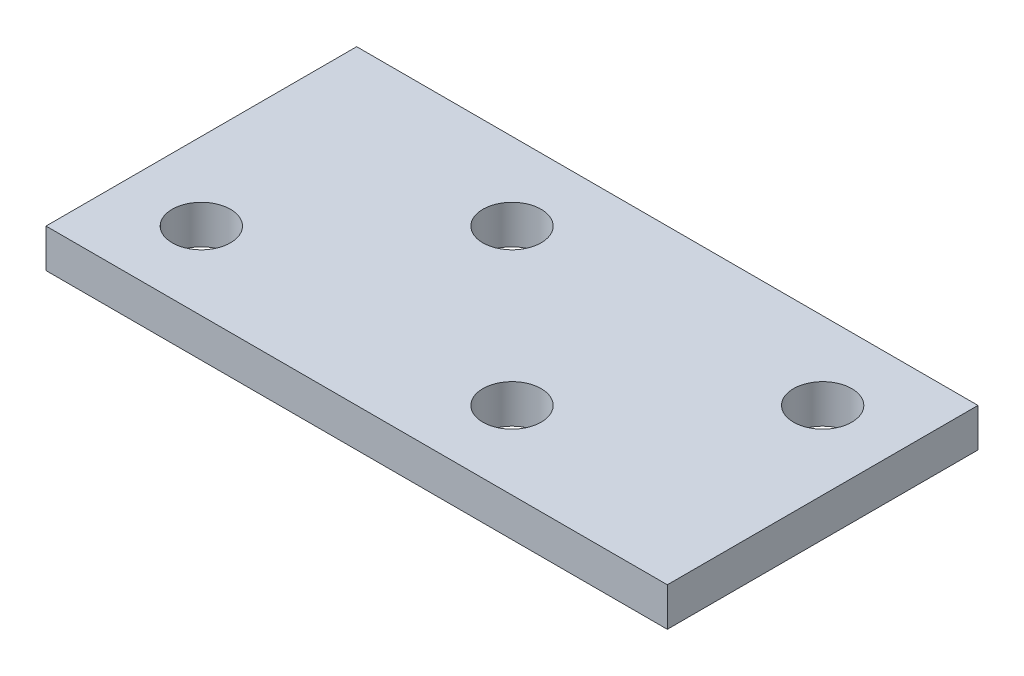
ISO-10303-21;
HEADER;
FILE_DESCRIPTION(('STEP AP214'),'2;1');
FILE_NAME('part.step','',(''),(''),'','','');
FILE_SCHEMA(('AUTOMOTIVE_DESIGN { 1 0 10303 214 1 1 1 1 }'));
ENDSEC;
DATA;
#1=APPLICATION_CONTEXT('core data for automotive mechanical design processes');
#2=APPLICATION_PROTOCOL_DEFINITION('international standard','automotive_design',2000,#1);
#3=PRODUCT_CONTEXT('',#1,'mechanical');
#4=PRODUCT('Part','Part','',(#3));
#5=PRODUCT_RELATED_PRODUCT_CATEGORY('part','',(#4));
#6=PRODUCT_DEFINITION_FORMATION('','',#4);
#7=PRODUCT_DEFINITION_CONTEXT('part definition',#1,'design');
#8=PRODUCT_DEFINITION('design','',#6,#7);
#9=PRODUCT_DEFINITION_SHAPE('','',#8);
#10=(LENGTH_UNIT() NAMED_UNIT(*) SI_UNIT(.MILLI.,.METRE.));
#11=(NAMED_UNIT(*) PLANE_ANGLE_UNIT() SI_UNIT($,.RADIAN.));
#12=(NAMED_UNIT(*) SI_UNIT($,.STERADIAN.) SOLID_ANGLE_UNIT());
#13=UNCERTAINTY_MEASURE_WITH_UNIT(LENGTH_MEASURE(1.E-05),#10,'distance_accuracy_value','');
#14=(GEOMETRIC_REPRESENTATION_CONTEXT(3) GLOBAL_UNCERTAINTY_ASSIGNED_CONTEXT((#13)) GLOBAL_UNIT_ASSIGNED_CONTEXT((#10,
#11,#12)) REPRESENTATION_CONTEXT('',''));
#15=CARTESIAN_POINT('',(0.,0.,0.));
#16=DIRECTION('',(0.,0.,1.));
#17=DIRECTION('',(1.,0.,0.));
#18=AXIS2_PLACEMENT_3D('',#15,#16,#17);
#19=CARTESIAN_POINT('',(50.8,6.31,-25.4));
#20=DIRECTION('',(-1.,0.,0.));
#21=DIRECTION('',(0.,0.,1.));
#22=AXIS2_PLACEMENT_3D('',#19,#20,#21);
#23=PLANE('',#22);
#24=DIRECTION('',(0.,0.,-1.));
#25=VECTOR('',#24,1.);
#26=CARTESIAN_POINT('',(50.8,0.,-25.4));
#27=LINE('',#26,#25);
#28=CARTESIAN_POINT('',(50.8,0.,25.4));
#29=VERTEX_POINT('',#28);
#30=CARTESIAN_POINT('',(50.8,0.,-25.4));
#31=VERTEX_POINT('',#30);
#32=EDGE_CURVE('E95',#29,#31,#27,.T.);
#33=ORIENTED_EDGE('',*,*,#32,.T.);
#34=DIRECTION('',(0.,-1.,0.));
#35=VECTOR('',#34,1.);
#36=CARTESIAN_POINT('',(50.8,6.31,-25.4));
#37=LINE('',#36,#35);
#38=CARTESIAN_POINT('',(50.8,6.31,-25.4));
#39=VERTEX_POINT('',#38);
#40=EDGE_CURVE('E11',#39,#31,#37,.T.);
#41=ORIENTED_EDGE('',*,*,#40,.F.);
#42=DIRECTION('',(0.,0.,-1.));
#43=VECTOR('',#42,1.);
#44=CARTESIAN_POINT('',(50.8,6.31,-25.4));
#45=LINE('',#44,#43);
#46=CARTESIAN_POINT('',(50.8,6.31,25.4));
#47=VERTEX_POINT('',#46);
#48=EDGE_CURVE('E83',#47,#39,#45,.T.);
#49=ORIENTED_EDGE('',*,*,#48,.F.);
#50=DIRECTION('',(0.,-1.,0.));
#51=VECTOR('',#50,1.);
#52=CARTESIAN_POINT('',(50.8,6.31,25.4));
#53=LINE('',#52,#51);
#54=EDGE_CURVE('E91',#47,#29,#53,.T.);
#55=ORIENTED_EDGE('',*,*,#54,.T.);
#56=EDGE_LOOP('',(#33,#41,#49,#55));
#57=FACE_BOUND('',#56,.T.);
#58=ADVANCED_FACE('F32',(#57),#23,.F.);
#59=CARTESIAN_POINT('',(-50.8,6.31,-25.4));
#60=DIRECTION('',(0.,0.,1.));
#61=DIRECTION('',(1.,0.,0.));
#62=AXIS2_PLACEMENT_3D('',#59,#60,#61);
#63=PLANE('',#62);
#64=DIRECTION('',(-1.,0.,0.));
#65=VECTOR('',#64,1.);
#66=CARTESIAN_POINT('',(-50.8,0.,-25.4));
#67=LINE('',#66,#65);
#68=CARTESIAN_POINT('',(-50.8,0.,-25.4));
#69=VERTEX_POINT('',#68);
#70=EDGE_CURVE('E87',#31,#69,#67,.T.);
#71=ORIENTED_EDGE('',*,*,#70,.T.);
#72=DIRECTION('',(0.,-1.,0.));
#73=VECTOR('',#72,1.);
#74=CARTESIAN_POINT('',(-50.8,6.31,-25.4));
#75=LINE('',#74,#73);
#76=CARTESIAN_POINT('',(-50.8,6.31,-25.4));
#77=VERTEX_POINT('',#76);
#78=EDGE_CURVE('E40',#77,#69,#75,.T.);
#79=ORIENTED_EDGE('',*,*,#78,.F.);
#80=DIRECTION('',(-1.,0.,0.));
#81=VECTOR('',#80,1.);
#82=CARTESIAN_POINT('',(-50.8,6.31,-25.4));
#83=LINE('',#82,#81);
#84=EDGE_CURVE('E78',#39,#77,#83,.T.);
#85=ORIENTED_EDGE('',*,*,#84,.F.);
#86=ORIENTED_EDGE('',*,*,#40,.T.);
#87=EDGE_LOOP('',(#71,#79,#85,#86));
#88=FACE_BOUND('',#87,.T.);
#89=ADVANCED_FACE('F86',(#88),#63,.F.);
#90=CARTESIAN_POINT('',(-50.8,6.31,-25.4));
#91=DIRECTION('',(1.,0.,0.));
#92=DIRECTION('',(0.,0.,-1.));
#93=AXIS2_PLACEMENT_3D('',#90,#91,#92);
#94=PLANE('',#93);
#95=DIRECTION('',(0.,0.,1.));
#96=VECTOR('',#95,1.);
#97=CARTESIAN_POINT('',(-50.8,0.,-25.4));
#98=LINE('',#97,#96);
#99=CARTESIAN_POINT('',(-50.8,0.,25.4));
#100=VERTEX_POINT('',#99);
#101=EDGE_CURVE('E65',#69,#100,#98,.T.);
#102=ORIENTED_EDGE('',*,*,#101,.T.);
#103=DIRECTION('',(0.,-1.,0.));
#104=VECTOR('',#103,1.);
#105=CARTESIAN_POINT('',(-50.8,6.31,25.4));
#106=LINE('',#105,#104);
#107=CARTESIAN_POINT('',(-50.8,6.31,25.4));
#108=VERTEX_POINT('',#107);
#109=EDGE_CURVE('E88',#108,#100,#106,.T.);
#110=ORIENTED_EDGE('',*,*,#109,.F.);
#111=DIRECTION('',(0.,0.,1.));
#112=VECTOR('',#111,1.);
#113=CARTESIAN_POINT('',(-50.8,6.31,-25.4));
#114=LINE('',#113,#112);
#115=EDGE_CURVE('E81',#77,#108,#114,.T.);
#116=ORIENTED_EDGE('',*,*,#115,.F.);
#117=ORIENTED_EDGE('',*,*,#78,.T.);
#118=EDGE_LOOP('',(#102,#110,#116,#117));
#119=FACE_BOUND('',#118,.T.);
#120=ADVANCED_FACE('F89',(#119),#94,.F.);
#121=CARTESIAN_POINT('',(-50.8,6.31,25.4));
#122=DIRECTION('',(0.,0.,-1.));
#123=DIRECTION('',(-1.,0.,0.));
#124=AXIS2_PLACEMENT_3D('',#121,#122,#123);
#125=PLANE('',#124);
#126=DIRECTION('',(1.,0.,0.));
#127=VECTOR('',#126,1.);
#128=CARTESIAN_POINT('',(-50.8,0.,25.4));
#129=LINE('',#128,#127);
#130=EDGE_CURVE('E71',#100,#29,#129,.T.);
#131=ORIENTED_EDGE('',*,*,#130,.T.);
#132=ORIENTED_EDGE('',*,*,#54,.F.);
#133=DIRECTION('',(1.,0.,0.));
#134=VECTOR('',#133,1.);
#135=CARTESIAN_POINT('',(-50.8,6.31,25.4));
#136=LINE('',#135,#134);
#137=EDGE_CURVE('E48',#108,#47,#136,.T.);
#138=ORIENTED_EDGE('',*,*,#137,.F.);
#139=ORIENTED_EDGE('',*,*,#109,.T.);
#140=EDGE_LOOP('',(#131,#132,#138,#139));
#141=FACE_BOUND('',#140,.T.);
#142=ADVANCED_FACE('F103',(#141),#125,.F.);
#143=CARTESIAN_POINT('',(0.,6.31,0.));
#144=DIRECTION('',(0.,1.,0.));
#145=DIRECTION('',(0.,0.,1.));
#146=AXIS2_PLACEMENT_3D('',#143,#144,#145);
#147=PLANE('',#146);
#148=CARTESIAN_POINT('',(38.1,6.31,-12.7));
#149=DIRECTION('',(0.,1.,0.));
#150=DIRECTION('',(0.,0.,1.));
#151=AXIS2_PLACEMENT_3D('',#148,#149,#150);
#152=CIRCLE('',#151,4.7625);
#153=CARTESIAN_POINT('',(38.1,6.31,-7.9375));
#154=VERTEX_POINT('',#153);
#155=EDGE_CURVE('E127',#154,#154,#152,.T.);
#156=ORIENTED_EDGE('',*,*,#155,.F.);
#157=EDGE_LOOP('',(#156));
#158=FACE_BOUND('',#157,.T.);
#159=CARTESIAN_POINT('',(12.7,6.31,12.7));
#160=DIRECTION('',(0.,1.,0.));
#161=DIRECTION('',(0.,0.,1.));
#162=AXIS2_PLACEMENT_3D('',#159,#160,#161);
#163=CIRCLE('',#162,4.7625);
#164=CARTESIAN_POINT('',(12.7,6.31,17.4625));
#165=VERTEX_POINT('',#164);
#166=EDGE_CURVE('E121',#165,#165,#163,.T.);
#167=ORIENTED_EDGE('',*,*,#166,.F.);
#168=EDGE_LOOP('',(#167));
#169=FACE_BOUND('',#168,.T.);
#170=CARTESIAN_POINT('',(-12.7,6.31,-12.7));
#171=DIRECTION('',(0.,1.,0.));
#172=DIRECTION('',(0.,0.,1.));
#173=AXIS2_PLACEMENT_3D('',#170,#171,#172);
#174=CIRCLE('',#173,4.7625);
#175=CARTESIAN_POINT('',(-12.7,6.31,-7.9375));
#176=VERTEX_POINT('',#175);
#177=EDGE_CURVE('E115',#176,#176,#174,.T.);
#178=ORIENTED_EDGE('',*,*,#177,.F.);
#179=EDGE_LOOP('',(#178));
#180=FACE_BOUND('',#179,.T.);
#181=CARTESIAN_POINT('',(-38.1,6.31,12.7));
#182=DIRECTION('',(0.,1.,0.));
#183=DIRECTION('',(0.,0.,1.));
#184=AXIS2_PLACEMENT_3D('',#181,#182,#183);
#185=CIRCLE('',#184,4.7625);
#186=CARTESIAN_POINT('',(-38.1,6.31,17.4625));
#187=VERTEX_POINT('',#186);
#188=EDGE_CURVE('E109',#187,#187,#185,.T.);
#189=ORIENTED_EDGE('',*,*,#188,.F.);
#190=EDGE_LOOP('',(#189));
#191=FACE_BOUND('',#190,.T.);
#192=ORIENTED_EDGE('',*,*,#48,.T.);
#193=ORIENTED_EDGE('',*,*,#84,.T.);
#194=ORIENTED_EDGE('',*,*,#115,.T.);
#195=ORIENTED_EDGE('',*,*,#137,.T.);
#196=EDGE_LOOP('',(#192,#193,#194,#195));
#197=FACE_BOUND('',#196,.T.);
#198=ADVANCED_FACE('F79',(#158,#169,#180,#191,#197),#147,.T.);
#199=CARTESIAN_POINT('',(0.,0.,0.));
#200=DIRECTION('',(0.,1.,0.));
#201=DIRECTION('',(0.,0.,1.));
#202=AXIS2_PLACEMENT_3D('',#199,#200,#201);
#203=PLANE('',#202);
#204=CARTESIAN_POINT('',(38.1,0.,-12.7));
#205=DIRECTION('',(0.,1.,0.));
#206=DIRECTION('',(0.,0.,1.));
#207=AXIS2_PLACEMENT_3D('',#204,#205,#206);
#208=CIRCLE('',#207,4.7625);
#209=CARTESIAN_POINT('',(38.1,0.,-7.9375));
#210=VERTEX_POINT('',#209);
#211=EDGE_CURVE('E124',#210,#210,#208,.T.);
#212=ORIENTED_EDGE('',*,*,#211,.T.);
#213=EDGE_LOOP('',(#212));
#214=FACE_BOUND('',#213,.T.);
#215=CARTESIAN_POINT('',(12.7,0.,12.7));
#216=DIRECTION('',(0.,1.,0.));
#217=DIRECTION('',(0.,0.,1.));
#218=AXIS2_PLACEMENT_3D('',#215,#216,#217);
#219=CIRCLE('',#218,4.7625);
#220=CARTESIAN_POINT('',(12.7,0.,17.4625));
#221=VERTEX_POINT('',#220);
#222=EDGE_CURVE('E118',#221,#221,#219,.T.);
#223=ORIENTED_EDGE('',*,*,#222,.T.);
#224=EDGE_LOOP('',(#223));
#225=FACE_BOUND('',#224,.T.);
#226=CARTESIAN_POINT('',(-12.7,0.,-12.7));
#227=DIRECTION('',(0.,1.,0.));
#228=DIRECTION('',(0.,0.,1.));
#229=AXIS2_PLACEMENT_3D('',#226,#227,#228);
#230=CIRCLE('',#229,4.7625);
#231=CARTESIAN_POINT('',(-12.7,0.,-7.9375));
#232=VERTEX_POINT('',#231);
#233=EDGE_CURVE('E112',#232,#232,#230,.T.);
#234=ORIENTED_EDGE('',*,*,#233,.T.);
#235=EDGE_LOOP('',(#234));
#236=FACE_BOUND('',#235,.T.);
#237=CARTESIAN_POINT('',(-38.1,0.,12.7));
#238=DIRECTION('',(0.,1.,0.));
#239=DIRECTION('',(0.,0.,1.));
#240=AXIS2_PLACEMENT_3D('',#237,#238,#239);
#241=CIRCLE('',#240,4.7625);
#242=CARTESIAN_POINT('',(-38.1,0.,17.4625));
#243=VERTEX_POINT('',#242);
#244=EDGE_CURVE('E98',#243,#243,#241,.T.);
#245=ORIENTED_EDGE('',*,*,#244,.T.);
#246=EDGE_LOOP('',(#245));
#247=FACE_BOUND('',#246,.T.);
#248=ORIENTED_EDGE('',*,*,#32,.F.);
#249=ORIENTED_EDGE('',*,*,#130,.F.);
#250=ORIENTED_EDGE('',*,*,#101,.F.);
#251=ORIENTED_EDGE('',*,*,#70,.F.);
#252=EDGE_LOOP('',(#248,#249,#250,#251));
#253=FACE_BOUND('',#252,.T.);
#254=ADVANCED_FACE('F106',(#214,#225,#236,#247,#253),#203,.F.);
#255=CARTESIAN_POINT('',(-38.1,0.,12.7));
#256=DIRECTION('',(0.,1.,0.));
#257=DIRECTION('',(0.,0.,1.));
#258=AXIS2_PLACEMENT_3D('',#255,#256,#257);
#259=CYLINDRICAL_SURFACE('',#258,4.7625);
#260=ORIENTED_EDGE('',*,*,#244,.F.);
#261=EDGE_LOOP('',(#260));
#262=FACE_BOUND('',#261,.T.);
#263=ORIENTED_EDGE('',*,*,#188,.T.);
#264=EDGE_LOOP('',(#263));
#265=FACE_BOUND('',#264,.T.);
#266=ADVANCED_FACE('F151',(#262,#265),#259,.F.);
#267=CARTESIAN_POINT('',(-12.7,0.,-12.7));
#268=DIRECTION('',(0.,1.,0.));
#269=DIRECTION('',(0.,0.,1.));
#270=AXIS2_PLACEMENT_3D('',#267,#268,#269);
#271=CYLINDRICAL_SURFACE('',#270,4.7625);
#272=ORIENTED_EDGE('',*,*,#233,.F.);
#273=EDGE_LOOP('',(#272));
#274=FACE_BOUND('',#273,.T.);
#275=ORIENTED_EDGE('',*,*,#177,.T.);
#276=EDGE_LOOP('',(#275));
#277=FACE_BOUND('',#276,.T.);
#278=ADVANCED_FACE('F153',(#274,#277),#271,.F.);
#279=CARTESIAN_POINT('',(12.7,0.,12.7));
#280=DIRECTION('',(0.,1.,0.));
#281=DIRECTION('',(0.,0.,1.));
#282=AXIS2_PLACEMENT_3D('',#279,#280,#281);
#283=CYLINDRICAL_SURFACE('',#282,4.7625);
#284=ORIENTED_EDGE('',*,*,#222,.F.);
#285=EDGE_LOOP('',(#284));
#286=FACE_BOUND('',#285,.T.);
#287=ORIENTED_EDGE('',*,*,#166,.T.);
#288=EDGE_LOOP('',(#287));
#289=FACE_BOUND('',#288,.T.);
#290=ADVANCED_FACE('F138',(#286,#289),#283,.F.);
#291=CARTESIAN_POINT('',(38.1,0.,-12.7));
#292=DIRECTION('',(0.,1.,0.));
#293=DIRECTION('',(0.,0.,1.));
#294=AXIS2_PLACEMENT_3D('',#291,#292,#293);
#295=CYLINDRICAL_SURFACE('',#294,4.7625);
#296=ORIENTED_EDGE('',*,*,#211,.F.);
#297=EDGE_LOOP('',(#296));
#298=FACE_BOUND('',#297,.T.);
#299=ORIENTED_EDGE('',*,*,#155,.T.);
#300=EDGE_LOOP('',(#299));
#301=FACE_BOUND('',#300,.T.);
#302=ADVANCED_FACE('F135',(#298,#301),#295,.F.);
#303=CLOSED_SHELL('',(#58,#89,#120,#142,#198,#254,#266,#278,#290,#302));
#304=MANIFOLD_SOLID_BREP('B2',#303);
#305=ADVANCED_BREP_SHAPE_REPRESENTATION('',(#18,#304),#14);
#306=SHAPE_DEFINITION_REPRESENTATION(#9,#305);
ENDSEC;
END-ISO-10303-21;
